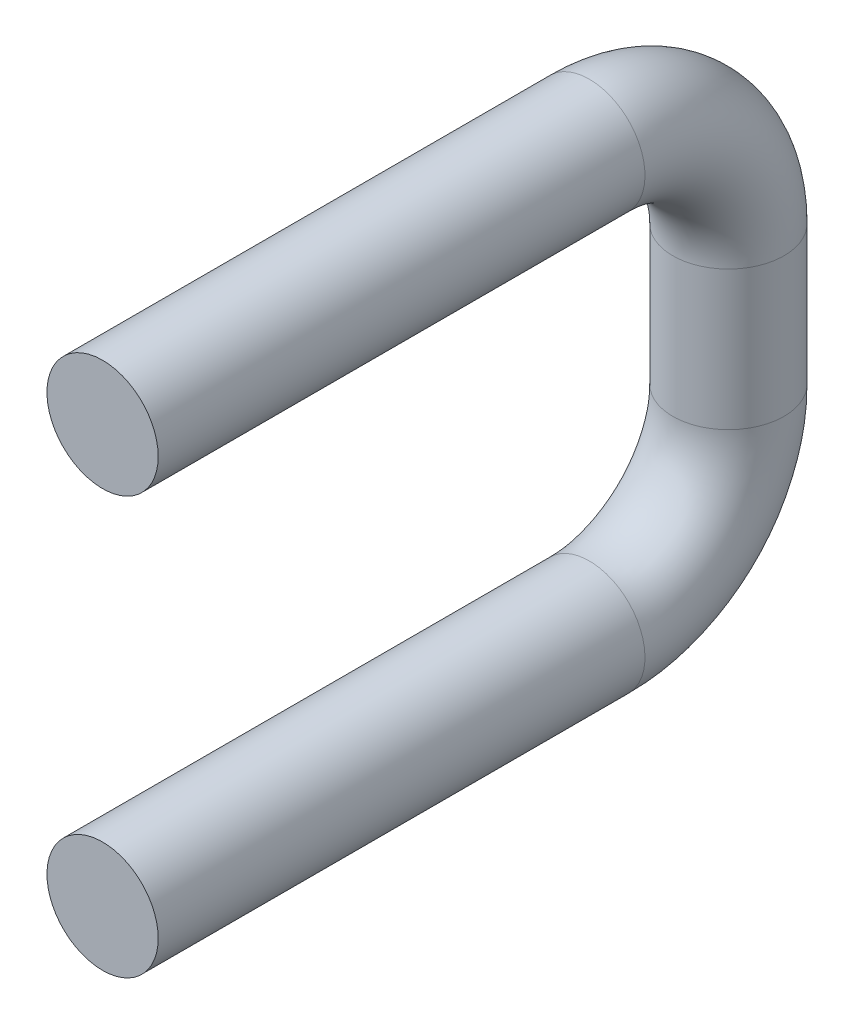
ISO-10303-21;
HEADER;
FILE_DESCRIPTION(('STEP AP214'),'2;1');
FILE_NAME('part.step','',(''),(''),'','','');
FILE_SCHEMA(('AUTOMOTIVE_DESIGN { 1 0 10303 214 1 1 1 1 }'));
ENDSEC;
DATA;
#1=APPLICATION_CONTEXT('core data for automotive mechanical design processes');
#2=APPLICATION_PROTOCOL_DEFINITION('international standard','automotive_design',2000,#1);
#3=PRODUCT_CONTEXT('',#1,'mechanical');
#4=PRODUCT('Part','Part','',(#3));
#5=PRODUCT_RELATED_PRODUCT_CATEGORY('part','',(#4));
#6=PRODUCT_DEFINITION_FORMATION('','',#4);
#7=PRODUCT_DEFINITION_CONTEXT('part definition',#1,'design');
#8=PRODUCT_DEFINITION('design','',#6,#7);
#9=PRODUCT_DEFINITION_SHAPE('','',#8);
#10=(LENGTH_UNIT() NAMED_UNIT(*) SI_UNIT(.MILLI.,.METRE.));
#11=(NAMED_UNIT(*) PLANE_ANGLE_UNIT() SI_UNIT($,.RADIAN.));
#12=(NAMED_UNIT(*) SI_UNIT($,.STERADIAN.) SOLID_ANGLE_UNIT());
#13=UNCERTAINTY_MEASURE_WITH_UNIT(LENGTH_MEASURE(1.E-05),#10,'distance_accuracy_value','');
#14=(GEOMETRIC_REPRESENTATION_CONTEXT(3) GLOBAL_UNCERTAINTY_ASSIGNED_CONTEXT((#13)) GLOBAL_UNIT_ASSIGNED_CONTEXT((#10,
#11,#12)) REPRESENTATION_CONTEXT('',''));
#15=CARTESIAN_POINT('',(0.,0.,0.));
#16=DIRECTION('',(0.,0.,1.));
#17=DIRECTION('',(1.,0.,0.));
#18=AXIS2_PLACEMENT_3D('',#15,#16,#17);
#19=CARTESIAN_POINT('',(0.,14.9999999999932,2.92771759216867E-12));
#20=DIRECTION('',(0.,1.95181172811334E-13,-1.));
#21=DIRECTION('',(1.,0.,0.));
#22=AXIS2_PLACEMENT_3D('',#19,#20,#21);
#23=PLANE('',#22);
#24=CARTESIAN_POINT('',(0.,14.9999999999932,2.92771759216867E-12));
#25=DIRECTION('',(0.,1.95181172811334E-13,-1.));
#26=DIRECTION('',(1.,0.,0.));
#27=AXIS2_PLACEMENT_3D('',#24,#25,#26);
#28=CIRCLE('',#27,4.);
#29=CARTESIAN_POINT('',(4.,14.9999999999932,2.92771759216867E-12));
#30=VERTEX_POINT('',#29);
#31=EDGE_CURVE('E66',#30,#30,#28,.T.);
#32=ORIENTED_EDGE('',*,*,#31,.F.);
#33=EDGE_LOOP('',(#32));
#34=FACE_BOUND('',#33,.T.);
#35=ADVANCED_FACE('F44',(#34),#23,.F.);
#36=CARTESIAN_POINT('',(0.,-14.9999999999932,0.));
#37=DIRECTION('',(0.,0.,1.));
#38=DIRECTION('',(1.,0.,0.));
#39=AXIS2_PLACEMENT_3D('',#36,#37,#38);
#40=PLANE('',#39);
#41=CARTESIAN_POINT('',(0.,-14.9999999999932,0.));
#42=DIRECTION('',(0.,0.,1.));
#43=DIRECTION('',(1.,0.,0.));
#44=AXIS2_PLACEMENT_3D('',#41,#42,#43);
#45=CIRCLE('',#44,4.);
#46=CARTESIAN_POINT('',(4.,-14.9999999999932,0.));
#47=VERTEX_POINT('',#46);
#48=EDGE_CURVE('E12',#47,#47,#45,.T.);
#49=ORIENTED_EDGE('',*,*,#48,.T.);
#50=EDGE_LOOP('',(#49));
#51=FACE_BOUND('',#50,.T.);
#52=ADVANCED_FACE('F73',(#51),#40,.T.);
#53=CARTESIAN_POINT('',(0.,14.9999999999932,2.92771759216867E-12));
#54=DIRECTION('',(0.,0.,-1.));
#55=DIRECTION('',(0.,1.,0.));
#56=AXIS2_PLACEMENT_3D('',#53,#54,#55);
#57=CYLINDRICAL_SURFACE('',#56,4.);
#58=CARTESIAN_POINT('',(0.,15.,-35.));
#59=DIRECTION('',(0.,1.95181172811334E-13,-1.));
#60=DIRECTION('',(1.,0.,0.));
#61=AXIS2_PLACEMENT_3D('',#58,#59,#60);
#62=CIRCLE('',#61,4.);
#63=CARTESIAN_POINT('',(0.,19.,-35.0000000000001));
#64=VERTEX_POINT('',#63);
#65=EDGE_CURVE('E63',#64,#64,#62,.T.);
#66=ORIENTED_EDGE('',*,*,#65,.F.);
#67=EDGE_LOOP('',(#66));
#68=FACE_BOUND('',#67,.T.);
#69=ORIENTED_EDGE('',*,*,#31,.T.);
#70=EDGE_LOOP('',(#69));
#71=FACE_BOUND('',#70,.T.);
#72=ADVANCED_FACE('F70',(#68,#71),#57,.T.);
#73=CARTESIAN_POINT('',(0.,5.00000000000001,-35.));
#74=DIRECTION('',(-1.,0.,0.));
#75=DIRECTION('',(0.,0.,1.));
#76=AXIS2_PLACEMENT_3D('',#73,#74,#75);
#77=TOROIDAL_SURFACE('',#76,10.,4.);
#78=CARTESIAN_POINT('',(0.,4.99999999999996,-45.));
#79=DIRECTION('',(0.,-1.,-1.95317472513018E-13));
#80=DIRECTION('',(1.,0.,0.));
#81=AXIS2_PLACEMENT_3D('',#78,#79,#80);
#82=CIRCLE('',#81,4.);
#83=CARTESIAN_POINT('',(0.,4.99999999999994,-49.));
#84=VERTEX_POINT('',#83);
#85=EDGE_CURVE('E58',#84,#84,#82,.T.);
#86=CARTESIAN_POINT('',(0.,5.00000000000001,-35.));
#87=DIRECTION('',(-1.,0.,0.));
#88=DIRECTION('',(0.,0.,1.));
#89=AXIS2_PLACEMENT_3D('',#86,#87,#88);
#90=CIRCLE('',#89,14.);
#91=EDGE_CURVE('',#64,#84,#90,.T.);
#92=ORIENTED_EDGE('',*,*,#65,.T.);
#93=ORIENTED_EDGE('',*,*,#85,.F.);
#94=ORIENTED_EDGE('',*,*,#91,.T.);
#95=ORIENTED_EDGE('',*,*,#91,.F.);
#96=EDGE_LOOP('',(#92,#94,#93,#95));
#97=FACE_BOUND('',#96,.T.);
#98=ADVANCED_FACE('F91',(#97),#77,.T.);
#99=CARTESIAN_POINT('',(0.,4.99999999999996,-45.));
#100=DIRECTION('',(0.,-1.,0.));
#101=DIRECTION('',(0.,0.,-1.));
#102=AXIS2_PLACEMENT_3D('',#99,#100,#101);
#103=CYLINDRICAL_SURFACE('',#102,4.);
#104=CARTESIAN_POINT('',(0.,-5.00000000000007,-45.));
#105=DIRECTION('',(0.,-1.,-1.95230736339219E-13));
#106=DIRECTION('',(1.,0.,0.));
#107=AXIS2_PLACEMENT_3D('',#104,#105,#106);
#108=CIRCLE('',#107,4.);
#109=CARTESIAN_POINT('',(0.,-5.00000000000009,-49.));
#110=VERTEX_POINT('',#109);
#111=EDGE_CURVE('E54',#110,#110,#108,.T.);
#112=ORIENTED_EDGE('',*,*,#111,.F.);
#113=EDGE_LOOP('',(#112));
#114=FACE_BOUND('',#113,.T.);
#115=ORIENTED_EDGE('',*,*,#85,.T.);
#116=EDGE_LOOP('',(#115));
#117=FACE_BOUND('',#116,.T.);
#118=ADVANCED_FACE('F85',(#114,#117),#103,.T.);
#119=CARTESIAN_POINT('',(0.,-5.00000000000001,-35.));
#120=DIRECTION('',(-1.,0.,0.));
#121=DIRECTION('',(0.,0.,1.));
#122=AXIS2_PLACEMENT_3D('',#119,#120,#121);
#123=TOROIDAL_SURFACE('',#122,10.,4.);
#124=CARTESIAN_POINT('',(0.,-15.,-34.999999999997));
#125=DIRECTION('',(0.,0.,1.));
#126=DIRECTION('',(1.,0.,0.));
#127=AXIS2_PLACEMENT_3D('',#124,#125,#126);
#128=CIRCLE('',#127,4.);
#129=CARTESIAN_POINT('',(0.,-19.,-34.9999999999958));
#130=VERTEX_POINT('',#129);
#131=EDGE_CURVE('E50',#130,#130,#128,.T.);
#132=CARTESIAN_POINT('',(0.,-5.00000000000001,-35.));
#133=DIRECTION('',(-1.,0.,0.));
#134=DIRECTION('',(0.,0.,1.));
#135=AXIS2_PLACEMENT_3D('',#132,#133,#134);
#136=CIRCLE('',#135,14.);
#137=EDGE_CURVE('',#110,#130,#136,.T.);
#138=ORIENTED_EDGE('',*,*,#111,.T.);
#139=ORIENTED_EDGE('',*,*,#131,.F.);
#140=ORIENTED_EDGE('',*,*,#137,.T.);
#141=ORIENTED_EDGE('',*,*,#137,.F.);
#142=EDGE_LOOP('',(#138,#140,#139,#141));
#143=FACE_BOUND('',#142,.T.);
#144=ADVANCED_FACE('F79',(#143),#123,.T.);
#145=CARTESIAN_POINT('',(0.,-15.,-35.));
#146=DIRECTION('',(0.,1.95230736339219E-13,1.));
#147=DIRECTION('',(0.,-1.,1.95230736339219E-13));
#148=AXIS2_PLACEMENT_3D('',#145,#146,#147);
#149=CYLINDRICAL_SURFACE('',#148,4.);
#150=ORIENTED_EDGE('',*,*,#48,.F.);
#151=EDGE_LOOP('',(#150));
#152=FACE_BOUND('',#151,.T.);
#153=ORIENTED_EDGE('',*,*,#131,.T.);
#154=EDGE_LOOP('',(#153));
#155=FACE_BOUND('',#154,.T.);
#156=ADVANCED_FACE('F77',(#152,#155),#149,.T.);
#157=CLOSED_SHELL('',(#35,#52,#72,#98,#118,#144,#156));
#158=MANIFOLD_SOLID_BREP('B2',#157);
#159=ADVANCED_BREP_SHAPE_REPRESENTATION('',(#18,#158),#14);
#160=SHAPE_DEFINITION_REPRESENTATION(#9,#159);
ENDSEC;
END-ISO-10303-21;
